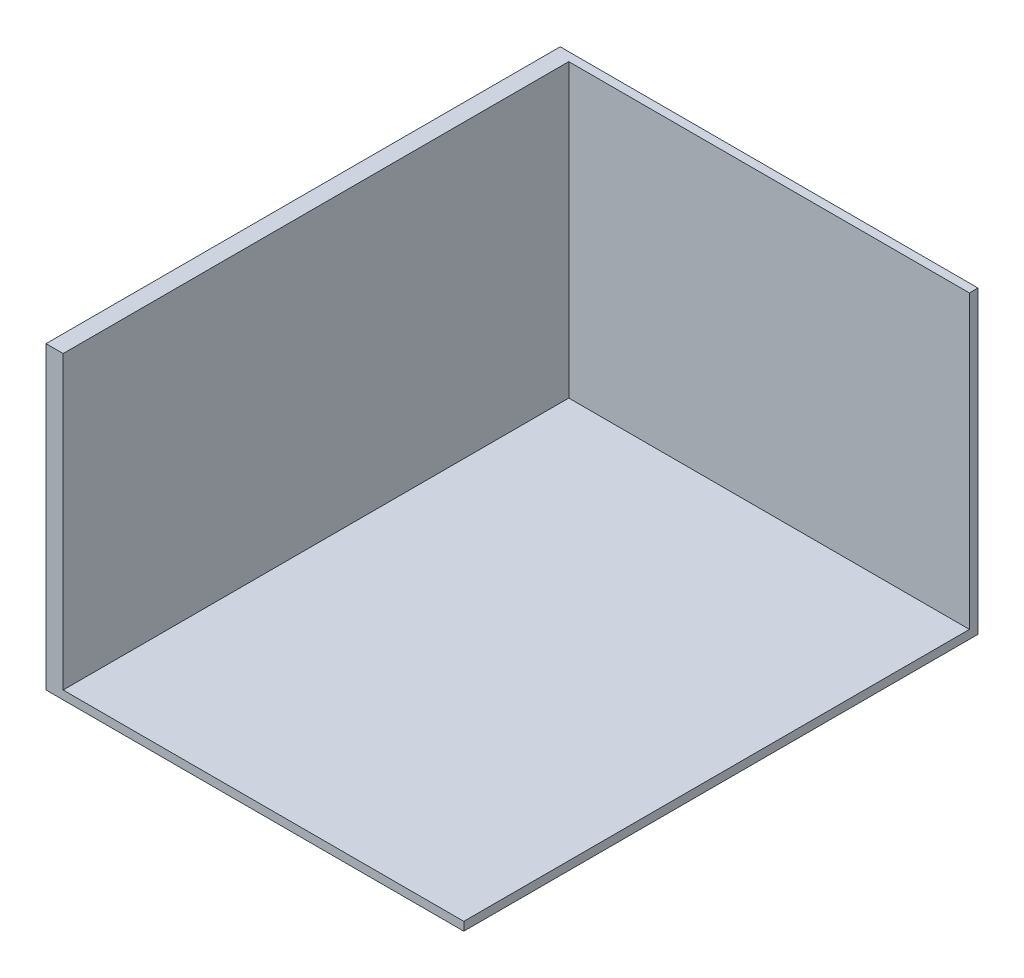
ISO-10303-21;
HEADER;
FILE_DESCRIPTION(('STEP AP214'),'2;1');
FILE_NAME('part.step','',(''),(''),'','','');
FILE_SCHEMA(('AUTOMOTIVE_DESIGN { 1 0 10303 214 1 1 1 1 }'));
ENDSEC;
DATA;
#1=APPLICATION_CONTEXT('core data for automotive mechanical design processes');
#2=APPLICATION_PROTOCOL_DEFINITION('international standard','automotive_design',2000,#1);
#3=PRODUCT_CONTEXT('',#1,'mechanical');
#4=PRODUCT('Part','Part','',(#3));
#5=PRODUCT_RELATED_PRODUCT_CATEGORY('part','',(#4));
#6=PRODUCT_DEFINITION_FORMATION('','',#4);
#7=PRODUCT_DEFINITION_CONTEXT('part definition',#1,'design');
#8=PRODUCT_DEFINITION('design','',#6,#7);
#9=PRODUCT_DEFINITION_SHAPE('','',#8);
#10=(LENGTH_UNIT() NAMED_UNIT(*) SI_UNIT(.MILLI.,.METRE.));
#11=(NAMED_UNIT(*) PLANE_ANGLE_UNIT() SI_UNIT($,.RADIAN.));
#12=(NAMED_UNIT(*) SI_UNIT($,.STERADIAN.) SOLID_ANGLE_UNIT());
#13=UNCERTAINTY_MEASURE_WITH_UNIT(LENGTH_MEASURE(1.E-05),#10,'distance_accuracy_value','');
#14=(GEOMETRIC_REPRESENTATION_CONTEXT(3) GLOBAL_UNCERTAINTY_ASSIGNED_CONTEXT((#13)) GLOBAL_UNIT_ASSIGNED_CONTEXT((#10,
#11,#12)) REPRESENTATION_CONTEXT('',''));
#15=CARTESIAN_POINT('',(0.,0.,0.));
#16=DIRECTION('',(0.,0.,1.));
#17=DIRECTION('',(1.,0.,0.));
#18=AXIS2_PLACEMENT_3D('',#15,#16,#17);
#19=CARTESIAN_POINT('',(0.,2.,0.));
#20=DIRECTION('',(0.,1.,0.));
#21=DIRECTION('',(0.,0.,1.));
#22=AXIS2_PLACEMENT_3D('',#19,#20,#21);
#23=PLANE('',#22);
#24=DIRECTION('',(1.,0.,0.));
#25=VECTOR('',#24,1.);
#26=CARTESIAN_POINT('',(-48.75,2.,-58.));
#27=LINE('',#26,#25);
#28=CARTESIAN_POINT('',(-44.75,2.,-58.));
#29=VERTEX_POINT('',#28);
#30=CARTESIAN_POINT('',(48.75,2.,-58.));
#31=VERTEX_POINT('',#30);
#32=EDGE_CURVE('E169',#29,#31,#27,.T.);
#33=ORIENTED_EDGE('',*,*,#32,.F.);
#34=DIRECTION('',(0.,0.,-1.));
#35=VECTOR('',#34,1.);
#36=CARTESIAN_POINT('',(-44.75,2.,-58.));
#37=LINE('',#36,#35);
#38=CARTESIAN_POINT('',(-44.75,2.,60.));
#39=VERTEX_POINT('',#38);
#40=EDGE_CURVE('E157',#39,#29,#37,.T.);
#41=ORIENTED_EDGE('',*,*,#40,.F.);
#42=DIRECTION('',(1.,0.,0.));
#43=VECTOR('',#42,1.);
#44=CARTESIAN_POINT('',(-48.75,2.,60.));
#45=LINE('',#44,#43);
#46=CARTESIAN_POINT('',(48.75,2.,60.));
#47=VERTEX_POINT('',#46);
#48=EDGE_CURVE('E189',#39,#47,#45,.T.);
#49=ORIENTED_EDGE('',*,*,#48,.T.);
#50=DIRECTION('',(0.,0.,-1.));
#51=VECTOR('',#50,1.);
#52=CARTESIAN_POINT('',(48.75,2.,-60.));
#53=LINE('',#52,#51);
#54=EDGE_CURVE('E186',#47,#31,#53,.T.);
#55=ORIENTED_EDGE('',*,*,#54,.T.);
#56=EDGE_LOOP('',(#33,#41,#49,#55));
#57=FACE_BOUND('',#56,.T.);
#58=ADVANCED_FACE('F38',(#57),#23,.T.);
#59=CARTESIAN_POINT('',(-48.75,70.,-58.));
#60=DIRECTION('',(0.,0.,-1.));
#61=DIRECTION('',(-1.,0.,0.));
#62=AXIS2_PLACEMENT_3D('',#59,#60,#61);
#63=PLANE('',#62);
#64=DIRECTION('',(0.,-1.,0.));
#65=VECTOR('',#64,1.);
#66=CARTESIAN_POINT('',(-44.75,70.,-58.));
#67=LINE('',#66,#65);
#68=CARTESIAN_POINT('',(-44.75,70.,-58.));
#69=VERTEX_POINT('',#68);
#70=EDGE_CURVE('E61',#69,#29,#67,.T.);
#71=ORIENTED_EDGE('',*,*,#70,.T.);
#72=ORIENTED_EDGE('',*,*,#32,.T.);
#73=DIRECTION('',(0.,-1.,0.));
#74=VECTOR('',#73,1.);
#75=CARTESIAN_POINT('',(48.75,70.,-58.));
#76=LINE('',#75,#74);
#77=CARTESIAN_POINT('',(48.75,70.,-58.));
#78=VERTEX_POINT('',#77);
#79=EDGE_CURVE('E181',#78,#31,#76,.T.);
#80=ORIENTED_EDGE('',*,*,#79,.F.);
#81=DIRECTION('',(1.,0.,0.));
#82=VECTOR('',#81,1.);
#83=CARTESIAN_POINT('',(-48.75,70.,-58.));
#84=LINE('',#83,#82);
#85=EDGE_CURVE('E173',#69,#78,#84,.T.);
#86=ORIENTED_EDGE('',*,*,#85,.F.);
#87=EDGE_LOOP('',(#71,#72,#80,#86));
#88=FACE_BOUND('',#87,.T.);
#89=ADVANCED_FACE('F233',(#88),#63,.F.);
#90=CARTESIAN_POINT('',(48.75,2.,-60.));
#91=DIRECTION('',(-1.,0.,0.));
#92=DIRECTION('',(0.,0.,1.));
#93=AXIS2_PLACEMENT_3D('',#90,#91,#92);
#94=PLANE('',#93);
#95=DIRECTION('',(0.,0.,-1.));
#96=VECTOR('',#95,1.);
#97=CARTESIAN_POINT('',(48.75,0.,-60.));
#98=LINE('',#97,#96);
#99=CARTESIAN_POINT('',(48.75,0.,60.));
#100=VERTEX_POINT('',#99);
#101=CARTESIAN_POINT('',(48.75,0.,-60.));
#102=VERTEX_POINT('',#101);
#103=EDGE_CURVE('E185',#100,#102,#98,.T.);
#104=ORIENTED_EDGE('',*,*,#103,.T.);
#105=DIRECTION('',(0.,-1.,0.));
#106=VECTOR('',#105,1.);
#107=CARTESIAN_POINT('',(48.75,2.,-60.));
#108=LINE('',#107,#106);
#109=CARTESIAN_POINT('',(48.75,70.,-60.));
#110=VERTEX_POINT('',#109);
#111=EDGE_CURVE('E11',#110,#102,#108,.T.);
#112=ORIENTED_EDGE('',*,*,#111,.F.);
#113=DIRECTION('',(0.,0.,-1.));
#114=VECTOR('',#113,1.);
#115=CARTESIAN_POINT('',(48.75,70.,-60.));
#116=LINE('',#115,#114);
#117=EDGE_CURVE('E175',#78,#110,#116,.T.);
#118=ORIENTED_EDGE('',*,*,#117,.F.);
#119=ORIENTED_EDGE('',*,*,#79,.T.);
#120=ORIENTED_EDGE('',*,*,#54,.F.);
#121=DIRECTION('',(0.,-1.,0.));
#122=VECTOR('',#121,1.);
#123=CARTESIAN_POINT('',(48.75,2.,60.));
#124=LINE('',#123,#122);
#125=EDGE_CURVE('E192',#47,#100,#124,.T.);
#126=ORIENTED_EDGE('',*,*,#125,.T.);
#127=EDGE_LOOP('',(#104,#112,#118,#119,#120,#126));
#128=FACE_BOUND('',#127,.T.);
#129=ADVANCED_FACE('F40',(#128),#94,.F.);
#130=CARTESIAN_POINT('',(-48.75,2.,-60.));
#131=DIRECTION('',(0.,0.,1.));
#132=DIRECTION('',(1.,0.,0.));
#133=AXIS2_PLACEMENT_3D('',#130,#131,#132);
#134=PLANE('',#133);
#135=DIRECTION('',(-1.,0.,0.));
#136=VECTOR('',#135,1.);
#137=CARTESIAN_POINT('',(-48.75,0.,-60.));
#138=LINE('',#137,#136);
#139=CARTESIAN_POINT('',(-48.75,0.,-60.));
#140=VERTEX_POINT('',#139);
#141=EDGE_CURVE('E195',#102,#140,#138,.T.);
#142=ORIENTED_EDGE('',*,*,#141,.T.);
#143=DIRECTION('',(0.,-1.,0.));
#144=VECTOR('',#143,1.);
#145=CARTESIAN_POINT('',(-48.75,2.,-60.));
#146=LINE('',#145,#144);
#147=CARTESIAN_POINT('',(-48.75,70.,-60.));
#148=VERTEX_POINT('',#147);
#149=EDGE_CURVE('E46',#148,#140,#146,.T.);
#150=ORIENTED_EDGE('',*,*,#149,.F.);
#151=DIRECTION('',(-1.,0.,0.));
#152=VECTOR('',#151,1.);
#153=CARTESIAN_POINT('',(-48.75,70.,-60.));
#154=LINE('',#153,#152);
#155=EDGE_CURVE('E178',#110,#148,#154,.T.);
#156=ORIENTED_EDGE('',*,*,#155,.F.);
#157=ORIENTED_EDGE('',*,*,#111,.T.);
#158=EDGE_LOOP('',(#142,#150,#156,#157));
#159=FACE_BOUND('',#158,.T.);
#160=ADVANCED_FACE('F234',(#159),#134,.F.);
#161=CARTESIAN_POINT('',(-48.75,2.,-60.));
#162=DIRECTION('',(1.,0.,0.));
#163=DIRECTION('',(0.,0.,-1.));
#164=AXIS2_PLACEMENT_3D('',#161,#162,#163);
#165=PLANE('',#164);
#166=DIRECTION('',(0.,0.,1.));
#167=VECTOR('',#166,1.);
#168=CARTESIAN_POINT('',(-48.75,1.,-15.25));
#169=LINE('',#168,#167);
#170=CARTESIAN_POINT('',(-48.75,1.,-15.25));
#171=VERTEX_POINT('',#170);
#172=CARTESIAN_POINT('',(-48.75,1.,15.25));
#173=VERTEX_POINT('',#172);
#174=EDGE_CURVE('E151',#171,#173,#169,.T.);
#175=ORIENTED_EDGE('',*,*,#174,.F.);
#176=DIRECTION('',(0.,-1.,0.));
#177=VECTOR('',#176,1.);
#178=CARTESIAN_POINT('',(-48.75,31.5,-15.25));
#179=LINE('',#178,#177);
#180=CARTESIAN_POINT('',(-48.75,31.5,-15.25));
#181=VERTEX_POINT('',#180);
#182=EDGE_CURVE('E53',#181,#171,#179,.T.);
#183=ORIENTED_EDGE('',*,*,#182,.F.);
#184=DIRECTION('',(0.,0.,-1.));
#185=VECTOR('',#184,1.);
#186=CARTESIAN_POINT('',(-48.75,31.5,-15.25));
#187=LINE('',#186,#185);
#188=CARTESIAN_POINT('',(-48.75,31.5,15.25));
#189=VERTEX_POINT('',#188);
#190=EDGE_CURVE('E142',#189,#181,#187,.T.);
#191=ORIENTED_EDGE('',*,*,#190,.F.);
#192=DIRECTION('',(0.,1.,0.));
#193=VECTOR('',#192,1.);
#194=CARTESIAN_POINT('',(-48.75,31.5,15.25));
#195=LINE('',#194,#193);
#196=EDGE_CURVE('E145',#173,#189,#195,.T.);
#197=ORIENTED_EDGE('',*,*,#196,.F.);
#198=EDGE_LOOP('',(#175,#183,#191,#197));
#199=FACE_BOUND('',#198,.T.);
#200=DIRECTION('',(0.,-1.,0.));
#201=VECTOR('',#200,1.);
#202=CARTESIAN_POINT('',(-48.75,2.,60.));
#203=LINE('',#202,#201);
#204=CARTESIAN_POINT('',(-48.75,70.,60.));
#205=VERTEX_POINT('',#204);
#206=CARTESIAN_POINT('',(-48.75,0.,60.));
#207=VERTEX_POINT('',#206);
#208=EDGE_CURVE('E202',#205,#207,#203,.T.);
#209=ORIENTED_EDGE('',*,*,#208,.F.);
#210=DIRECTION('',(0.,0.,1.));
#211=VECTOR('',#210,1.);
#212=CARTESIAN_POINT('',(-48.75,70.,-60.));
#213=LINE('',#212,#211);
#214=EDGE_CURVE('E170',#148,#205,#213,.T.);
#215=ORIENTED_EDGE('',*,*,#214,.F.);
#216=ORIENTED_EDGE('',*,*,#149,.T.);
#217=DIRECTION('',(0.,0.,1.));
#218=VECTOR('',#217,1.);
#219=CARTESIAN_POINT('',(-48.75,0.,-60.));
#220=LINE('',#219,#218);
#221=EDGE_CURVE('E197',#140,#207,#220,.T.);
#222=ORIENTED_EDGE('',*,*,#221,.T.);
#223=EDGE_LOOP('',(#209,#215,#216,#222));
#224=FACE_BOUND('',#223,.T.);
#225=ADVANCED_FACE('F208',(#199,#224),#165,.F.);
#226=CARTESIAN_POINT('',(-48.75,2.,60.));
#227=DIRECTION('',(0.,0.,-1.));
#228=DIRECTION('',(-1.,0.,0.));
#229=AXIS2_PLACEMENT_3D('',#226,#227,#228);
#230=PLANE('',#229);
#231=DIRECTION('',(1.,0.,0.));
#232=VECTOR('',#231,1.);
#233=CARTESIAN_POINT('',(-48.75,0.,60.));
#234=LINE('',#233,#232);
#235=EDGE_CURVE('E190',#207,#100,#234,.T.);
#236=ORIENTED_EDGE('',*,*,#235,.T.);
#237=ORIENTED_EDGE('',*,*,#125,.F.);
#238=ORIENTED_EDGE('',*,*,#48,.F.);
#239=DIRECTION('',(0.,-1.,0.));
#240=VECTOR('',#239,1.);
#241=CARTESIAN_POINT('',(-44.75,70.,60.));
#242=LINE('',#241,#240);
#243=CARTESIAN_POINT('',(-44.75,70.,60.));
#244=VERTEX_POINT('',#243);
#245=EDGE_CURVE('E167',#244,#39,#242,.T.);
#246=ORIENTED_EDGE('',*,*,#245,.F.);
#247=DIRECTION('',(1.,0.,0.));
#248=VECTOR('',#247,1.);
#249=CARTESIAN_POINT('',(-48.75,70.,60.));
#250=LINE('',#249,#248);
#251=EDGE_CURVE('E161',#205,#244,#250,.T.);
#252=ORIENTED_EDGE('',*,*,#251,.F.);
#253=ORIENTED_EDGE('',*,*,#208,.T.);
#254=EDGE_LOOP('',(#236,#237,#238,#246,#252,#253));
#255=FACE_BOUND('',#254,.T.);
#256=ADVANCED_FACE('F217',(#255),#230,.F.);
#257=CARTESIAN_POINT('',(0.,0.,0.));
#258=DIRECTION('',(0.,1.,0.));
#259=DIRECTION('',(0.,0.,1.));
#260=AXIS2_PLACEMENT_3D('',#257,#258,#259);
#261=PLANE('',#260);
#262=ORIENTED_EDGE('',*,*,#103,.F.);
#263=ORIENTED_EDGE('',*,*,#235,.F.);
#264=ORIENTED_EDGE('',*,*,#221,.F.);
#265=ORIENTED_EDGE('',*,*,#141,.F.);
#266=EDGE_LOOP('',(#262,#263,#264,#265));
#267=FACE_BOUND('',#266,.T.);
#268=ADVANCED_FACE('F214',(#267),#261,.F.);
#269=CARTESIAN_POINT('',(0.,70.,0.));
#270=DIRECTION('',(0.,1.,0.));
#271=DIRECTION('',(0.,0.,1.));
#272=AXIS2_PLACEMENT_3D('',#269,#270,#271);
#273=PLANE('',#272);
#274=ORIENTED_EDGE('',*,*,#214,.T.);
#275=ORIENTED_EDGE('',*,*,#251,.T.);
#276=DIRECTION('',(0.,0.,-1.));
#277=VECTOR('',#276,1.);
#278=CARTESIAN_POINT('',(-44.75,70.,-58.));
#279=LINE('',#278,#277);
#280=EDGE_CURVE('E163',#244,#69,#279,.T.);
#281=ORIENTED_EDGE('',*,*,#280,.T.);
#282=ORIENTED_EDGE('',*,*,#85,.T.);
#283=ORIENTED_EDGE('',*,*,#117,.T.);
#284=ORIENTED_EDGE('',*,*,#155,.T.);
#285=EDGE_LOOP('',(#274,#275,#281,#282,#283,#284));
#286=FACE_BOUND('',#285,.T.);
#287=ADVANCED_FACE('F231',(#286),#273,.T.);
#288=CARTESIAN_POINT('',(-44.75,70.,-58.));
#289=DIRECTION('',(-1.,0.,0.));
#290=DIRECTION('',(0.,0.,1.));
#291=AXIS2_PLACEMENT_3D('',#288,#289,#290);
#292=PLANE('',#291);
#293=ORIENTED_EDGE('',*,*,#40,.T.);
#294=ORIENTED_EDGE('',*,*,#70,.F.);
#295=ORIENTED_EDGE('',*,*,#280,.F.);
#296=ORIENTED_EDGE('',*,*,#245,.T.);
#297=EDGE_LOOP('',(#293,#294,#295,#296));
#298=FACE_BOUND('',#297,.T.);
#299=ADVANCED_FACE('F228',(#298),#292,.F.);
#300=CARTESIAN_POINT('',(-46.75,31.5,-15.25));
#301=DIRECTION('',(0.,0.,-1.));
#302=DIRECTION('',(-1.,0.,0.));
#303=AXIS2_PLACEMENT_3D('',#300,#301,#302);
#304=PLANE('',#303);
#305=ORIENTED_EDGE('',*,*,#182,.T.);
#306=DIRECTION('',(-1.,0.,0.));
#307=VECTOR('',#306,1.);
#308=CARTESIAN_POINT('',(-46.75,1.,-15.25));
#309=LINE('',#308,#307);
#310=CARTESIAN_POINT('',(-46.75,1.,-15.25));
#311=VERTEX_POINT('',#310);
#312=EDGE_CURVE('E120',#311,#171,#309,.T.);
#313=ORIENTED_EDGE('',*,*,#312,.F.);
#314=DIRECTION('',(0.,-1.,0.));
#315=VECTOR('',#314,1.);
#316=CARTESIAN_POINT('',(-46.75,31.5,-15.25));
#317=LINE('',#316,#315);
#318=CARTESIAN_POINT('',(-46.75,31.5,-15.25));
#319=VERTEX_POINT('',#318);
#320=EDGE_CURVE('E124',#319,#311,#317,.T.);
#321=ORIENTED_EDGE('',*,*,#320,.F.);
#322=DIRECTION('',(-1.,0.,0.));
#323=VECTOR('',#322,1.);
#324=CARTESIAN_POINT('',(-46.75,31.5,-15.25));
#325=LINE('',#324,#323);
#326=EDGE_CURVE('E155',#319,#181,#325,.T.);
#327=ORIENTED_EDGE('',*,*,#326,.T.);
#328=EDGE_LOOP('',(#305,#313,#321,#327));
#329=FACE_BOUND('',#328,.T.);
#330=ADVANCED_FACE('F122',(#329),#304,.F.);
#331=CARTESIAN_POINT('',(-46.75,31.5,-15.25));
#332=DIRECTION('',(0.,1.,0.));
#333=DIRECTION('',(0.,0.,1.));
#334=AXIS2_PLACEMENT_3D('',#331,#332,#333);
#335=PLANE('',#334);
#336=ORIENTED_EDGE('',*,*,#190,.T.);
#337=ORIENTED_EDGE('',*,*,#326,.F.);
#338=DIRECTION('',(0.,0.,-1.));
#339=VECTOR('',#338,1.);
#340=CARTESIAN_POINT('',(-46.75,31.5,-15.25));
#341=LINE('',#340,#339);
#342=CARTESIAN_POINT('',(-46.75,31.5,15.25));
#343=VERTEX_POINT('',#342);
#344=EDGE_CURVE('E130',#343,#319,#341,.T.);
#345=ORIENTED_EDGE('',*,*,#344,.F.);
#346=DIRECTION('',(-1.,0.,0.));
#347=VECTOR('',#346,1.);
#348=CARTESIAN_POINT('',(-46.75,31.5,15.25));
#349=LINE('',#348,#347);
#350=EDGE_CURVE('E158',#343,#189,#349,.T.);
#351=ORIENTED_EDGE('',*,*,#350,.T.);
#352=EDGE_LOOP('',(#336,#337,#345,#351));
#353=FACE_BOUND('',#352,.T.);
#354=ADVANCED_FACE('F282',(#353),#335,.F.);
#355=CARTESIAN_POINT('',(-46.75,31.5,15.25));
#356=DIRECTION('',(0.,0.,1.));
#357=DIRECTION('',(1.,0.,0.));
#358=AXIS2_PLACEMENT_3D('',#355,#356,#357);
#359=PLANE('',#358);
#360=ORIENTED_EDGE('',*,*,#196,.T.);
#361=ORIENTED_EDGE('',*,*,#350,.F.);
#362=DIRECTION('',(0.,1.,0.));
#363=VECTOR('',#362,1.);
#364=CARTESIAN_POINT('',(-46.75,31.5,15.25));
#365=LINE('',#364,#363);
#366=CARTESIAN_POINT('',(-46.75,1.,15.25));
#367=VERTEX_POINT('',#366);
#368=EDGE_CURVE('E138',#367,#343,#365,.T.);
#369=ORIENTED_EDGE('',*,*,#368,.F.);
#370=DIRECTION('',(-1.,0.,0.));
#371=VECTOR('',#370,1.);
#372=CARTESIAN_POINT('',(-46.75,1.,15.25));
#373=LINE('',#372,#371);
#374=EDGE_CURVE('E129',#367,#173,#373,.T.);
#375=ORIENTED_EDGE('',*,*,#374,.T.);
#376=EDGE_LOOP('',(#360,#361,#369,#375));
#377=FACE_BOUND('',#376,.T.);
#378=ADVANCED_FACE('F290',(#377),#359,.F.);
#379=CARTESIAN_POINT('',(-46.75,1.,-15.25));
#380=DIRECTION('',(0.,-1.,0.));
#381=DIRECTION('',(0.,0.,-1.));
#382=AXIS2_PLACEMENT_3D('',#379,#380,#381);
#383=PLANE('',#382);
#384=ORIENTED_EDGE('',*,*,#174,.T.);
#385=ORIENTED_EDGE('',*,*,#374,.F.);
#386=DIRECTION('',(0.,0.,1.));
#387=VECTOR('',#386,1.);
#388=CARTESIAN_POINT('',(-46.75,1.,-15.25));
#389=LINE('',#388,#387);
#390=EDGE_CURVE('E133',#311,#367,#389,.T.);
#391=ORIENTED_EDGE('',*,*,#390,.F.);
#392=ORIENTED_EDGE('',*,*,#312,.T.);
#393=EDGE_LOOP('',(#384,#385,#391,#392));
#394=FACE_BOUND('',#393,.T.);
#395=ADVANCED_FACE('F134',(#394),#383,.F.);
#396=CARTESIAN_POINT('',(-46.75,0.,0.));
#397=DIRECTION('',(-1.,0.,0.));
#398=DIRECTION('',(0.,0.,1.));
#399=AXIS2_PLACEMENT_3D('',#396,#397,#398);
#400=PLANE('',#399);
#401=ORIENTED_EDGE('',*,*,#320,.T.);
#402=ORIENTED_EDGE('',*,*,#390,.T.);
#403=ORIENTED_EDGE('',*,*,#368,.T.);
#404=ORIENTED_EDGE('',*,*,#344,.T.);
#405=EDGE_LOOP('',(#401,#402,#403,#404));
#406=FACE_BOUND('',#405,.T.);
#407=ADVANCED_FACE('F140',(#406),#400,.T.);
#408=CLOSED_SHELL('',(#58,#89,#129,#160,#225,#256,#268,#287,#299,#330,#354,#378,#395,#407));
#409=MANIFOLD_SOLID_BREP('B2',#408);
#410=ADVANCED_BREP_SHAPE_REPRESENTATION('',(#18,#409),#14);
#411=SHAPE_DEFINITION_REPRESENTATION(#9,#410);
ENDSEC;
END-ISO-10303-21;
